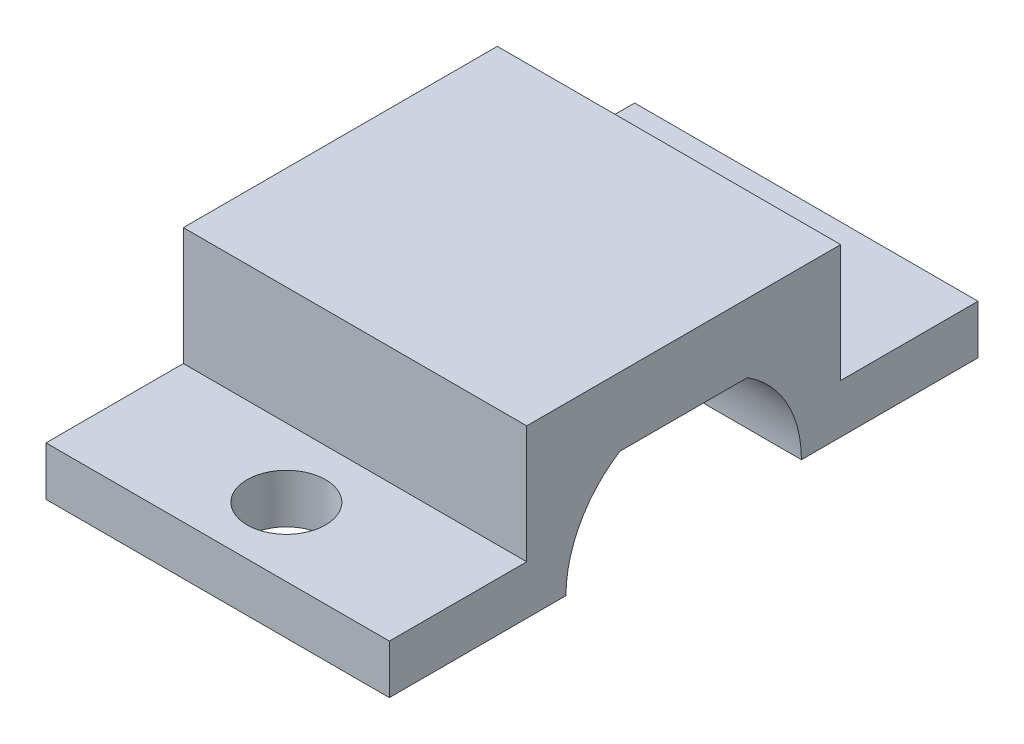
ISO-10303-21;
HEADER;
FILE_DESCRIPTION(('STEP AP214'),'2;1');
FILE_NAME('part.step','',(''),(''),'','','');
FILE_SCHEMA(('AUTOMOTIVE_DESIGN { 1 0 10303 214 1 1 1 1 }'));
ENDSEC;
DATA;
#1=APPLICATION_CONTEXT('core data for automotive mechanical design processes');
#2=APPLICATION_PROTOCOL_DEFINITION('international standard','automotive_design',2000,#1);
#3=PRODUCT_CONTEXT('',#1,'mechanical');
#4=PRODUCT('Part','Part','',(#3));
#5=PRODUCT_RELATED_PRODUCT_CATEGORY('part','',(#4));
#6=PRODUCT_DEFINITION_FORMATION('','',#4);
#7=PRODUCT_DEFINITION_CONTEXT('part definition',#1,'design');
#8=PRODUCT_DEFINITION('design','',#6,#7);
#9=PRODUCT_DEFINITION_SHAPE('','',#8);
#10=(LENGTH_UNIT() NAMED_UNIT(*) SI_UNIT(.MILLI.,.METRE.));
#11=(NAMED_UNIT(*) PLANE_ANGLE_UNIT() SI_UNIT($,.RADIAN.));
#12=(NAMED_UNIT(*) SI_UNIT($,.STERADIAN.) SOLID_ANGLE_UNIT());
#13=UNCERTAINTY_MEASURE_WITH_UNIT(LENGTH_MEASURE(1.E-05),#10,'distance_accuracy_value','');
#14=(GEOMETRIC_REPRESENTATION_CONTEXT(3) GLOBAL_UNCERTAINTY_ASSIGNED_CONTEXT((#13)) GLOBAL_UNIT_ASSIGNED_CONTEXT((#10,
#11,#12)) REPRESENTATION_CONTEXT('',''));
#15=CARTESIAN_POINT('',(0.,0.,0.));
#16=DIRECTION('',(0.,0.,1.));
#17=DIRECTION('',(1.,0.,0.));
#18=AXIS2_PLACEMENT_3D('',#15,#16,#17);
#19=CARTESIAN_POINT('',(8.75,-0.382935225196057,-8.));
#20=DIRECTION('',(0.,0.,1.));
#21=DIRECTION('',(1.,0.,0.));
#22=AXIS2_PLACEMENT_3D('',#19,#20,#21);
#23=PLANE('',#22);
#24=DIRECTION('',(0.,1.,0.));
#25=VECTOR('',#24,1.);
#26=CARTESIAN_POINT('',(-8.75,-0.382935225196057,-8.));
#27=LINE('',#26,#25);
#28=CARTESIAN_POINT('',(-8.75,-0.382935225196057,-8.));
#29=VERTEX_POINT('',#28);
#30=CARTESIAN_POINT('',(-8.75,5.61706477480394,-8.));
#31=VERTEX_POINT('',#30);
#32=EDGE_CURVE('E168',#29,#31,#27,.T.);
#33=ORIENTED_EDGE('',*,*,#32,.T.);
#34=DIRECTION('',(-1.,0.,0.));
#35=VECTOR('',#34,1.);
#36=CARTESIAN_POINT('',(8.75,5.61706477480394,-8.));
#37=LINE('',#36,#35);
#38=CARTESIAN_POINT('',(8.75,5.61706477480394,-8.));
#39=VERTEX_POINT('',#38);
#40=EDGE_CURVE('E11',#39,#31,#37,.T.);
#41=ORIENTED_EDGE('',*,*,#40,.F.);
#42=DIRECTION('',(0.,1.,0.));
#43=VECTOR('',#42,1.);
#44=CARTESIAN_POINT('',(8.75,-0.382935225196057,-8.));
#45=LINE('',#44,#43);
#46=CARTESIAN_POINT('',(8.75,-0.382935225196057,-8.));
#47=VERTEX_POINT('',#46);
#48=EDGE_CURVE('E203',#47,#39,#45,.T.);
#49=ORIENTED_EDGE('',*,*,#48,.F.);
#50=DIRECTION('',(-1.,0.,0.));
#51=VECTOR('',#50,1.);
#52=CARTESIAN_POINT('',(8.75,-0.382935225196057,-8.));
#53=LINE('',#52,#51);
#54=EDGE_CURVE('E164',#47,#29,#53,.T.);
#55=ORIENTED_EDGE('',*,*,#54,.T.);
#56=EDGE_LOOP('',(#33,#41,#49,#55));
#57=FACE_BOUND('',#56,.T.);
#58=ADVANCED_FACE('F43',(#57),#23,.F.);
#59=CARTESIAN_POINT('',(8.75,5.61706477480394,8.));
#60=DIRECTION('',(0.,-1.,0.));
#61=DIRECTION('',(0.,0.,-1.));
#62=AXIS2_PLACEMENT_3D('',#59,#60,#61);
#63=PLANE('',#62);
#64=DIRECTION('',(0.,0.,1.));
#65=VECTOR('',#64,1.);
#66=CARTESIAN_POINT('',(-8.75,5.61706477480394,8.));
#67=LINE('',#66,#65);
#68=CARTESIAN_POINT('',(-8.75,5.61706477480394,8.));
#69=VERTEX_POINT('',#68);
#70=EDGE_CURVE('E172',#31,#69,#67,.T.);
#71=ORIENTED_EDGE('',*,*,#70,.T.);
#72=DIRECTION('',(-1.,0.,0.));
#73=VECTOR('',#72,1.);
#74=CARTESIAN_POINT('',(8.75,5.61706477480394,8.));
#75=LINE('',#74,#73);
#76=CARTESIAN_POINT('',(8.75,5.61706477480394,8.));
#77=VERTEX_POINT('',#76);
#78=EDGE_CURVE('E52',#77,#69,#75,.T.);
#79=ORIENTED_EDGE('',*,*,#78,.F.);
#80=DIRECTION('',(0.,0.,1.));
#81=VECTOR('',#80,1.);
#82=CARTESIAN_POINT('',(8.75,5.61706477480394,8.));
#83=LINE('',#82,#81);
#84=EDGE_CURVE('E115',#39,#77,#83,.T.);
#85=ORIENTED_EDGE('',*,*,#84,.F.);
#86=ORIENTED_EDGE('',*,*,#40,.T.);
#87=EDGE_LOOP('',(#71,#79,#85,#86));
#88=FACE_BOUND('',#87,.T.);
#89=ADVANCED_FACE('F299',(#88),#63,.F.);
#90=CARTESIAN_POINT('',(8.75,-0.382935225196057,8.));
#91=DIRECTION('',(0.,0.,-1.));
#92=DIRECTION('',(-1.,0.,0.));
#93=AXIS2_PLACEMENT_3D('',#90,#91,#92);
#94=PLANE('',#93);
#95=DIRECTION('',(0.,-1.,0.));
#96=VECTOR('',#95,1.);
#97=CARTESIAN_POINT('',(-8.75,-0.382935225196057,8.));
#98=LINE('',#97,#96);
#99=CARTESIAN_POINT('',(-8.75,-0.382935225196057,8.));
#100=VERTEX_POINT('',#99);
#101=EDGE_CURVE('E176',#69,#100,#98,.T.);
#102=ORIENTED_EDGE('',*,*,#101,.T.);
#103=DIRECTION('',(-1.,0.,0.));
#104=VECTOR('',#103,1.);
#105=CARTESIAN_POINT('',(8.75,-0.382935225196057,8.));
#106=LINE('',#105,#104);
#107=CARTESIAN_POINT('',(8.75,-0.382935225196057,8.));
#108=VERTEX_POINT('',#107);
#109=EDGE_CURVE('E230',#108,#100,#106,.T.);
#110=ORIENTED_EDGE('',*,*,#109,.F.);
#111=DIRECTION('',(0.,-1.,0.));
#112=VECTOR('',#111,1.);
#113=CARTESIAN_POINT('',(8.75,-0.382935225196057,8.));
#114=LINE('',#113,#112);
#115=EDGE_CURVE('E240',#77,#108,#114,.T.);
#116=ORIENTED_EDGE('',*,*,#115,.F.);
#117=ORIENTED_EDGE('',*,*,#78,.T.);
#118=EDGE_LOOP('',(#102,#110,#116,#117));
#119=FACE_BOUND('',#118,.T.);
#120=ADVANCED_FACE('F238',(#119),#94,.F.);
#121=CARTESIAN_POINT('',(8.75,-0.382935225196057,15.));
#122=DIRECTION('',(0.,-1.,0.));
#123=DIRECTION('',(0.,0.,-1.));
#124=AXIS2_PLACEMENT_3D('',#121,#122,#123);
#125=PLANE('',#124);
#126=CARTESIAN_POINT('',(0.,-0.382935225196057,11.5));
#127=DIRECTION('',(0.,-1.,0.));
#128=DIRECTION('',(0.,0.,-1.));
#129=AXIS2_PLACEMENT_3D('',#126,#127,#128);
#130=CIRCLE('',#129,2.);
#131=CARTESIAN_POINT('',(0.,-0.382935225196057,9.5));
#132=VERTEX_POINT('',#131);
#133=EDGE_CURVE('E340',#132,#132,#130,.F.);
#134=ORIENTED_EDGE('',*,*,#133,.F.);
#135=EDGE_LOOP('',(#134));
#136=FACE_BOUND('',#135,.T.);
#137=DIRECTION('',(0.,0.,1.));
#138=VECTOR('',#137,1.);
#139=CARTESIAN_POINT('',(-8.75,-0.382935225196057,15.));
#140=LINE('',#139,#138);
#141=CARTESIAN_POINT('',(-8.75,-0.382935225196057,15.));
#142=VERTEX_POINT('',#141);
#143=EDGE_CURVE('E179',#100,#142,#140,.T.);
#144=ORIENTED_EDGE('',*,*,#143,.T.);
#145=DIRECTION('',(-1.,0.,0.));
#146=VECTOR('',#145,1.);
#147=CARTESIAN_POINT('',(8.75,-0.382935225196057,15.));
#148=LINE('',#147,#146);
#149=CARTESIAN_POINT('',(8.75,-0.382935225196057,15.));
#150=VERTEX_POINT('',#149);
#151=EDGE_CURVE('E226',#150,#142,#148,.T.);
#152=ORIENTED_EDGE('',*,*,#151,.F.);
#153=DIRECTION('',(0.,0.,1.));
#154=VECTOR('',#153,1.);
#155=CARTESIAN_POINT('',(8.75,-0.382935225196057,15.));
#156=LINE('',#155,#154);
#157=EDGE_CURVE('E259',#108,#150,#156,.T.);
#158=ORIENTED_EDGE('',*,*,#157,.F.);
#159=ORIENTED_EDGE('',*,*,#109,.T.);
#160=EDGE_LOOP('',(#144,#152,#158,#159));
#161=FACE_BOUND('',#160,.T.);
#162=ADVANCED_FACE('F249',(#136,#161),#125,.F.);
#163=CARTESIAN_POINT('',(8.75,-2.87965437535745,15.));
#164=DIRECTION('',(0.,0.,-1.));
#165=DIRECTION('',(-1.,0.,0.));
#166=AXIS2_PLACEMENT_3D('',#163,#164,#165);
#167=PLANE('',#166);
#168=DIRECTION('',(0.,-1.,0.));
#169=VECTOR('',#168,1.);
#170=CARTESIAN_POINT('',(-8.75,-2.87965437535745,15.));
#171=LINE('',#170,#169);
#172=CARTESIAN_POINT('',(-8.75,-2.87965437535745,15.));
#173=VERTEX_POINT('',#172);
#174=EDGE_CURVE('E182',#142,#173,#171,.T.);
#175=ORIENTED_EDGE('',*,*,#174,.T.);
#176=DIRECTION('',(-1.,0.,0.));
#177=VECTOR('',#176,1.);
#178=CARTESIAN_POINT('',(8.75,-2.87965437535745,15.));
#179=LINE('',#178,#177);
#180=CARTESIAN_POINT('',(8.75,-2.87965437535745,15.));
#181=VERTEX_POINT('',#180);
#182=EDGE_CURVE('E222',#181,#173,#179,.T.);
#183=ORIENTED_EDGE('',*,*,#182,.F.);
#184=DIRECTION('',(0.,-1.,0.));
#185=VECTOR('',#184,1.);
#186=CARTESIAN_POINT('',(8.75,-2.87965437535745,15.));
#187=LINE('',#186,#185);
#188=EDGE_CURVE('E255',#150,#181,#187,.T.);
#189=ORIENTED_EDGE('',*,*,#188,.F.);
#190=ORIENTED_EDGE('',*,*,#151,.T.);
#191=EDGE_LOOP('',(#175,#183,#189,#190));
#192=FACE_BOUND('',#191,.T.);
#193=ADVANCED_FACE('F253',(#192),#167,.F.);
#194=CARTESIAN_POINT('',(8.75,-2.87965437535745,15.));
#195=DIRECTION('',(0.,1.,0.));
#196=DIRECTION('',(0.,0.,1.));
#197=AXIS2_PLACEMENT_3D('',#194,#195,#196);
#198=PLANE('',#197);
#199=CARTESIAN_POINT('',(0.,-2.87965437535745,11.5));
#200=DIRECTION('',(0.,1.,0.));
#201=DIRECTION('',(0.,0.,1.));
#202=AXIS2_PLACEMENT_3D('',#199,#200,#201);
#203=CIRCLE('',#202,2.);
#204=CARTESIAN_POINT('',(0.,-2.87965437535745,13.5));
#205=VERTEX_POINT('',#204);
#206=EDGE_CURVE('E337',#205,#205,#203,.F.);
#207=ORIENTED_EDGE('',*,*,#206,.F.);
#208=EDGE_LOOP('',(#207));
#209=FACE_BOUND('',#208,.T.);
#210=DIRECTION('',(0.,0.,-1.));
#211=VECTOR('',#210,1.);
#212=CARTESIAN_POINT('',(-8.75,-2.87965437535745,15.));
#213=LINE('',#212,#211);
#214=CARTESIAN_POINT('',(-8.75,-2.87965437535745,5.99978885516359));
#215=VERTEX_POINT('',#214);
#216=EDGE_CURVE('E185',#173,#215,#213,.T.);
#217=ORIENTED_EDGE('',*,*,#216,.T.);
#218=DIRECTION('',(-1.,0.,0.));
#219=VECTOR('',#218,1.);
#220=CARTESIAN_POINT('',(8.75,-2.87965437535745,5.99978885516359));
#221=LINE('',#220,#219);
#222=CARTESIAN_POINT('',(8.75,-2.87965437535745,5.99978885516359));
#223=VERTEX_POINT('',#222);
#224=EDGE_CURVE('E218',#223,#215,#221,.T.);
#225=ORIENTED_EDGE('',*,*,#224,.F.);
#226=DIRECTION('',(0.,0.,-1.));
#227=VECTOR('',#226,1.);
#228=CARTESIAN_POINT('',(8.75,-2.87965437535745,15.));
#229=LINE('',#228,#227);
#230=EDGE_CURVE('E258',#181,#223,#229,.T.);
#231=ORIENTED_EDGE('',*,*,#230,.F.);
#232=ORIENTED_EDGE('',*,*,#182,.T.);
#233=EDGE_LOOP('',(#217,#225,#231,#232));
#234=FACE_BOUND('',#233,.T.);
#235=ADVANCED_FACE('F313',(#209,#234),#198,.F.);
#236=CARTESIAN_POINT('',(8.75,-2.87926965653291,0.079788867664314));
#237=DIRECTION('',(-1.,0.,0.));
#238=DIRECTION('',(0.,0.,1.));
#239=AXIS2_PLACEMENT_3D('',#236,#237,#238);
#240=CYLINDRICAL_SURFACE('',#239,5.92);
#241=CARTESIAN_POINT('',(-8.75,-2.87926965653291,0.079788867664314));
#242=DIRECTION('',(-1.,0.,0.));
#243=DIRECTION('',(0.,0.,1.));
#244=AXIS2_PLACEMENT_3D('',#241,#242,#243);
#245=CIRCLE('',#244,5.92);
#246=CARTESIAN_POINT('',(-8.75,2.12034562464255,3.2500013274589));
#247=VERTEX_POINT('',#246);
#248=EDGE_CURVE('E188',#215,#247,#245,.T.);
#249=ORIENTED_EDGE('',*,*,#248,.T.);
#250=DIRECTION('',(-1.,0.,0.));
#251=VECTOR('',#250,1.);
#252=CARTESIAN_POINT('',(8.75,2.12034562464255,3.2500013274589));
#253=LINE('',#252,#251);
#254=CARTESIAN_POINT('',(8.75,2.12034562464255,3.2500013274589));
#255=VERTEX_POINT('',#254);
#256=EDGE_CURVE('E214',#255,#247,#253,.T.);
#257=ORIENTED_EDGE('',*,*,#256,.F.);
#258=CARTESIAN_POINT('',(8.75,-2.87926965653291,0.079788867664314));
#259=DIRECTION('',(-1.,0.,0.));
#260=DIRECTION('',(0.,0.,1.));
#261=AXIS2_PLACEMENT_3D('',#258,#259,#260);
#262=CIRCLE('',#261,5.92);
#263=EDGE_CURVE('E263',#223,#255,#262,.T.);
#264=ORIENTED_EDGE('',*,*,#263,.F.);
#265=ORIENTED_EDGE('',*,*,#224,.T.);
#266=EDGE_LOOP('',(#249,#257,#264,#265));
#267=FACE_BOUND('',#266,.T.);
#268=ADVANCED_FACE('F316',(#267),#240,.F.);
#269=CARTESIAN_POINT('',(8.75,2.12034562464255,3.2500013274589));
#270=DIRECTION('',(0.,1.,0.));
#271=DIRECTION('',(0.,0.,1.));
#272=AXIS2_PLACEMENT_3D('',#269,#270,#271);
#273=PLANE('',#272);
#274=DIRECTION('',(0.,0.,-1.));
#275=VECTOR('',#274,1.);
#276=CARTESIAN_POINT('',(-8.75,2.12034562464255,3.2500013274589));
#277=LINE('',#276,#275);
#278=CARTESIAN_POINT('',(-8.75,2.12034562464255,-3.25000132745891));
#279=VERTEX_POINT('',#278);
#280=EDGE_CURVE('E191',#247,#279,#277,.T.);
#281=ORIENTED_EDGE('',*,*,#280,.T.);
#282=DIRECTION('',(-1.,0.,0.));
#283=VECTOR('',#282,1.);
#284=CARTESIAN_POINT('',(8.75,2.12034562464255,-3.25000132745891));
#285=LINE('',#284,#283);
#286=CARTESIAN_POINT('',(8.75,2.12034562464255,-3.25000132745891));
#287=VERTEX_POINT('',#286);
#288=EDGE_CURVE('E210',#287,#279,#285,.T.);
#289=ORIENTED_EDGE('',*,*,#288,.F.);
#290=DIRECTION('',(0.,0.,-1.));
#291=VECTOR('',#290,1.);
#292=CARTESIAN_POINT('',(8.75,2.12034562464255,3.2500013274589));
#293=LINE('',#292,#291);
#294=EDGE_CURVE('E270',#255,#287,#293,.T.);
#295=ORIENTED_EDGE('',*,*,#294,.F.);
#296=ORIENTED_EDGE('',*,*,#256,.T.);
#297=EDGE_LOOP('',(#281,#289,#295,#296));
#298=FACE_BOUND('',#297,.T.);
#299=ADVANCED_FACE('F278',(#298),#273,.F.);
#300=CARTESIAN_POINT('',(8.75,-2.8800742894416,-0.0802091090912764));
#301=DIRECTION('',(-1.,0.,0.));
#302=DIRECTION('',(0.,0.,1.));
#303=AXIS2_PLACEMENT_3D('',#300,#301,#302);
#304=CYLINDRICAL_SURFACE('',#303,5.92045454545454);
#305=CARTESIAN_POINT('',(-8.75,-2.8800742894416,-0.0802091090912764));
#306=DIRECTION('',(-1.,0.,0.));
#307=DIRECTION('',(0.,0.,-1.));
#308=AXIS2_PLACEMENT_3D('',#305,#306,#307);
#309=CIRCLE('',#308,5.92045454545454);
#310=CARTESIAN_POINT('',(-8.75,-2.87965437535745,-6.00066363965441));
#311=VERTEX_POINT('',#310);
#312=EDGE_CURVE('E194',#279,#311,#309,.T.);
#313=ORIENTED_EDGE('',*,*,#312,.T.);
#314=DIRECTION('',(-1.,0.,0.));
#315=VECTOR('',#314,1.);
#316=CARTESIAN_POINT('',(8.75,-2.87965437535745,-6.00066363965441));
#317=LINE('',#316,#315);
#318=CARTESIAN_POINT('',(8.75,-2.87965437535745,-6.00066363965441));
#319=VERTEX_POINT('',#318);
#320=EDGE_CURVE('E157',#319,#311,#317,.T.);
#321=ORIENTED_EDGE('',*,*,#320,.F.);
#322=CARTESIAN_POINT('',(8.75,-2.8800742894416,-0.0802091090912764));
#323=DIRECTION('',(-1.,0.,0.));
#324=DIRECTION('',(0.,0.,-1.));
#325=AXIS2_PLACEMENT_3D('',#322,#323,#324);
#326=CIRCLE('',#325,5.92045454545454);
#327=EDGE_CURVE('E146',#287,#319,#326,.T.);
#328=ORIENTED_EDGE('',*,*,#327,.F.);
#329=ORIENTED_EDGE('',*,*,#288,.T.);
#330=EDGE_LOOP('',(#313,#321,#328,#329));
#331=FACE_BOUND('',#330,.T.);
#332=ADVANCED_FACE('F282',(#331),#304,.F.);
#333=CARTESIAN_POINT('',(8.75,-2.87965437535745,-6.00066363965441));
#334=DIRECTION('',(0.,1.,0.));
#335=DIRECTION('',(0.,0.,1.));
#336=AXIS2_PLACEMENT_3D('',#333,#334,#335);
#337=PLANE('',#336);
#338=CARTESIAN_POINT('',(0.,-2.87965437535745,-11.5));
#339=DIRECTION('',(0.,1.,0.));
#340=DIRECTION('',(0.,0.,1.));
#341=AXIS2_PLACEMENT_3D('',#338,#339,#340);
#342=CIRCLE('',#341,2.);
#343=CARTESIAN_POINT('',(0.,-2.87965437535745,-9.5));
#344=VERTEX_POINT('',#343);
#345=EDGE_CURVE('E173',#344,#344,#342,.F.);
#346=ORIENTED_EDGE('',*,*,#345,.F.);
#347=EDGE_LOOP('',(#346));
#348=FACE_BOUND('',#347,.T.);
#349=DIRECTION('',(0.,0.,-1.));
#350=VECTOR('',#349,1.);
#351=CARTESIAN_POINT('',(-8.75,-2.87965437535745,-6.00066363965441));
#352=LINE('',#351,#350);
#353=CARTESIAN_POINT('',(-8.75,-2.87965437535745,-15.));
#354=VERTEX_POINT('',#353);
#355=EDGE_CURVE('E155',#311,#354,#352,.T.);
#356=ORIENTED_EDGE('',*,*,#355,.T.);
#357=DIRECTION('',(-1.,0.,0.));
#358=VECTOR('',#357,1.);
#359=CARTESIAN_POINT('',(8.75,-2.87965437535745,-15.));
#360=LINE('',#359,#358);
#361=CARTESIAN_POINT('',(8.75,-2.87965437535745,-15.));
#362=VERTEX_POINT('',#361);
#363=EDGE_CURVE('E152',#362,#354,#360,.T.);
#364=ORIENTED_EDGE('',*,*,#363,.F.);
#365=DIRECTION('',(0.,0.,-1.));
#366=VECTOR('',#365,1.);
#367=CARTESIAN_POINT('',(8.75,-2.87965437535745,-6.00066363965441));
#368=LINE('',#367,#366);
#369=EDGE_CURVE('E140',#319,#362,#368,.T.);
#370=ORIENTED_EDGE('',*,*,#369,.F.);
#371=ORIENTED_EDGE('',*,*,#320,.T.);
#372=EDGE_LOOP('',(#356,#364,#370,#371));
#373=FACE_BOUND('',#372,.T.);
#374=ADVANCED_FACE('F153',(#348,#373),#337,.F.);
#375=CARTESIAN_POINT('',(8.75,-2.87965437535745,-15.));
#376=DIRECTION('',(0.,0.,1.));
#377=DIRECTION('',(0.,-1.,0.));
#378=AXIS2_PLACEMENT_3D('',#375,#376,#377);
#379=PLANE('',#378);
#380=DIRECTION('',(0.,1.,0.));
#381=VECTOR('',#380,1.);
#382=CARTESIAN_POINT('',(-8.75,-2.87965437535745,-15.));
#383=LINE('',#382,#381);
#384=CARTESIAN_POINT('',(-8.75,-0.382935225196057,-15.));
#385=VERTEX_POINT('',#384);
#386=EDGE_CURVE('E101',#354,#385,#383,.T.);
#387=ORIENTED_EDGE('',*,*,#386,.T.);
#388=DIRECTION('',(-1.,0.,0.));
#389=VECTOR('',#388,1.);
#390=CARTESIAN_POINT('',(8.75,-0.382935225196057,-15.));
#391=LINE('',#390,#389);
#392=CARTESIAN_POINT('',(8.75,-0.382935225196057,-15.));
#393=VERTEX_POINT('',#392);
#394=EDGE_CURVE('E158',#393,#385,#391,.T.);
#395=ORIENTED_EDGE('',*,*,#394,.F.);
#396=DIRECTION('',(0.,1.,0.));
#397=VECTOR('',#396,1.);
#398=CARTESIAN_POINT('',(8.75,-2.87965437535745,-15.));
#399=LINE('',#398,#397);
#400=EDGE_CURVE('E144',#362,#393,#399,.T.);
#401=ORIENTED_EDGE('',*,*,#400,.F.);
#402=ORIENTED_EDGE('',*,*,#363,.T.);
#403=EDGE_LOOP('',(#387,#395,#401,#402));
#404=FACE_BOUND('',#403,.T.);
#405=ADVANCED_FACE('F160',(#404),#379,.F.);
#406=CARTESIAN_POINT('',(8.75,-0.382935225196057,-15.));
#407=DIRECTION('',(0.,-1.,0.));
#408=DIRECTION('',(0.,0.,-1.));
#409=AXIS2_PLACEMENT_3D('',#406,#407,#408);
#410=PLANE('',#409);
#411=CARTESIAN_POINT('',(0.,-0.382935225196057,-11.5));
#412=DIRECTION('',(0.,-1.,0.));
#413=DIRECTION('',(0.,0.,-1.));
#414=AXIS2_PLACEMENT_3D('',#411,#412,#413);
#415=CIRCLE('',#414,2.);
#416=CARTESIAN_POINT('',(0.,-0.382935225196057,-13.5));
#417=VERTEX_POINT('',#416);
#418=EDGE_CURVE('E333',#417,#417,#415,.F.);
#419=ORIENTED_EDGE('',*,*,#418,.F.);
#420=EDGE_LOOP('',(#419));
#421=FACE_BOUND('',#420,.T.);
#422=DIRECTION('',(0.,0.,1.));
#423=VECTOR('',#422,1.);
#424=CARTESIAN_POINT('',(-8.75,-0.382935225196057,-15.));
#425=LINE('',#424,#423);
#426=EDGE_CURVE('E107',#385,#29,#425,.T.);
#427=ORIENTED_EDGE('',*,*,#426,.T.);
#428=ORIENTED_EDGE('',*,*,#54,.F.);
#429=DIRECTION('',(0.,0.,1.));
#430=VECTOR('',#429,1.);
#431=CARTESIAN_POINT('',(8.75,-0.382935225196057,-15.));
#432=LINE('',#431,#430);
#433=EDGE_CURVE('E60',#393,#47,#432,.T.);
#434=ORIENTED_EDGE('',*,*,#433,.F.);
#435=ORIENTED_EDGE('',*,*,#394,.T.);
#436=EDGE_LOOP('',(#427,#428,#434,#435));
#437=FACE_BOUND('',#436,.T.);
#438=ADVANCED_FACE('F286',(#421,#437),#410,.F.);
#439=CARTESIAN_POINT('',(8.75,-2.87926965653291,0.079788867664314));
#440=DIRECTION('',(-1.,0.,0.));
#441=DIRECTION('',(0.,0.,1.));
#442=AXIS2_PLACEMENT_3D('',#439,#440,#441);
#443=PLANE('',#442);
#444=ORIENTED_EDGE('',*,*,#48,.T.);
#445=ORIENTED_EDGE('',*,*,#84,.T.);
#446=ORIENTED_EDGE('',*,*,#115,.T.);
#447=ORIENTED_EDGE('',*,*,#157,.T.);
#448=ORIENTED_EDGE('',*,*,#188,.T.);
#449=ORIENTED_EDGE('',*,*,#230,.T.);
#450=ORIENTED_EDGE('',*,*,#263,.T.);
#451=ORIENTED_EDGE('',*,*,#294,.T.);
#452=ORIENTED_EDGE('',*,*,#327,.T.);
#453=ORIENTED_EDGE('',*,*,#369,.T.);
#454=ORIENTED_EDGE('',*,*,#400,.T.);
#455=ORIENTED_EDGE('',*,*,#433,.T.);
#456=EDGE_LOOP('',(#444,#445,#446,#447,#448,#449,#450,#451,#452,#453,#454,#455));
#457=FACE_BOUND('',#456,.T.);
#458=ADVANCED_FACE('F142',(#457),#443,.F.);
#459=CARTESIAN_POINT('',(-8.75,-2.87926965653291,0.079788867664314));
#460=DIRECTION('',(-1.,0.,0.));
#461=DIRECTION('',(0.,0.,1.));
#462=AXIS2_PLACEMENT_3D('',#459,#460,#461);
#463=PLANE('',#462);
#464=ORIENTED_EDGE('',*,*,#32,.F.);
#465=ORIENTED_EDGE('',*,*,#426,.F.);
#466=ORIENTED_EDGE('',*,*,#386,.F.);
#467=ORIENTED_EDGE('',*,*,#355,.F.);
#468=ORIENTED_EDGE('',*,*,#312,.F.);
#469=ORIENTED_EDGE('',*,*,#280,.F.);
#470=ORIENTED_EDGE('',*,*,#248,.F.);
#471=ORIENTED_EDGE('',*,*,#216,.F.);
#472=ORIENTED_EDGE('',*,*,#174,.F.);
#473=ORIENTED_EDGE('',*,*,#143,.F.);
#474=ORIENTED_EDGE('',*,*,#101,.F.);
#475=ORIENTED_EDGE('',*,*,#70,.F.);
#476=EDGE_LOOP('',(#464,#465,#466,#467,#468,#469,#470,#471,#472,#473,#474,#475));
#477=FACE_BOUND('',#476,.T.);
#478=ADVANCED_FACE('F244',(#477),#463,.T.);
#479=CARTESIAN_POINT('',(0.,-2.88065437535745,-11.5));
#480=DIRECTION('',(0.,1.,0.));
#481=DIRECTION('',(0.,0.,1.));
#482=AXIS2_PLACEMENT_3D('',#479,#480,#481);
#483=CYLINDRICAL_SURFACE('',#482,2.);
#484=ORIENTED_EDGE('',*,*,#418,.T.);
#485=EDGE_LOOP('',(#484));
#486=FACE_BOUND('',#485,.T.);
#487=ORIENTED_EDGE('',*,*,#345,.T.);
#488=EDGE_LOOP('',(#487));
#489=FACE_BOUND('',#488,.T.);
#490=ADVANCED_FACE('F359',(#486,#489),#483,.F.);
#491=CARTESIAN_POINT('',(0.,-2.88065437535745,11.5));
#492=DIRECTION('',(0.,1.,0.));
#493=DIRECTION('',(0.,0.,1.));
#494=AXIS2_PLACEMENT_3D('',#491,#492,#493);
#495=CYLINDRICAL_SURFACE('',#494,2.);
#496=ORIENTED_EDGE('',*,*,#206,.T.);
#497=EDGE_LOOP('',(#496));
#498=FACE_BOUND('',#497,.T.);
#499=ORIENTED_EDGE('',*,*,#133,.T.);
#500=EDGE_LOOP('',(#499));
#501=FACE_BOUND('',#500,.T.);
#502=ADVANCED_FACE('F353',(#498,#501),#495,.F.);
#503=CLOSED_SHELL('',(#58,#89,#120,#162,#193,#235,#268,#299,#332,#374,#405,#438,#458,#478,#490,#502));
#504=MANIFOLD_SOLID_BREP('B2',#503);
#505=ADVANCED_BREP_SHAPE_REPRESENTATION('',(#18,#504),#14);
#506=SHAPE_DEFINITION_REPRESENTATION(#9,#505);
ENDSEC;
END-ISO-10303-21;
